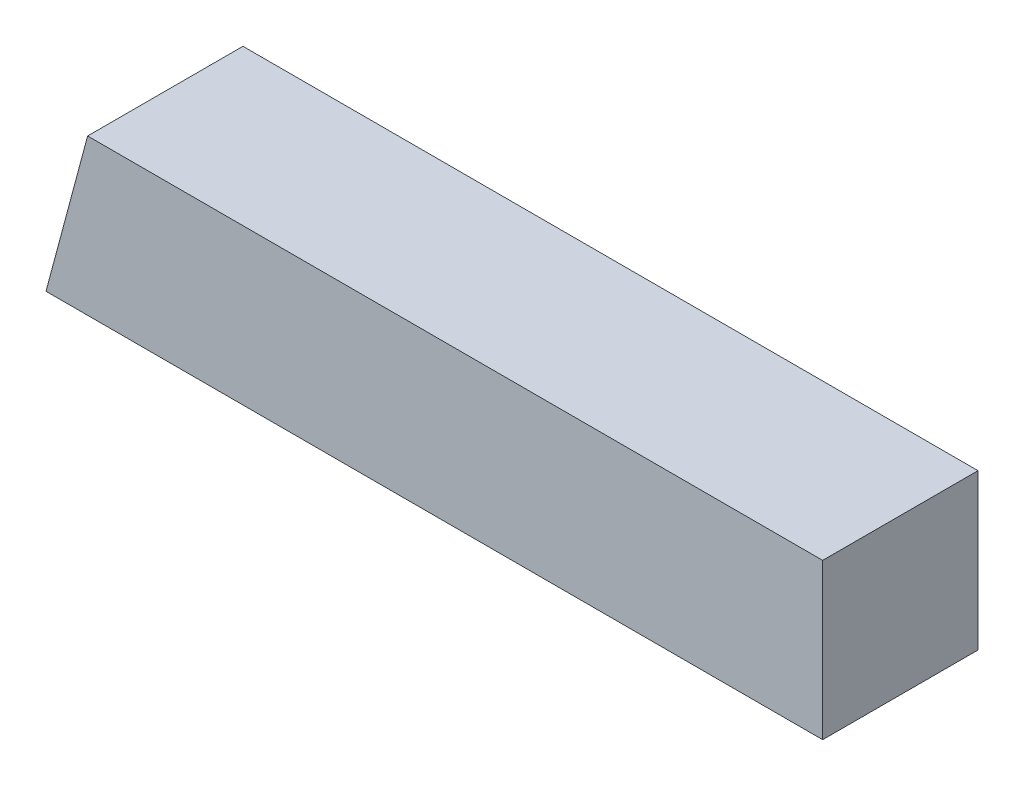
ISO-10303-21;
HEADER;
FILE_DESCRIPTION(('STEP AP214'),'2;1');
FILE_NAME('part.step','',(''),(''),'','','');
FILE_SCHEMA(('AUTOMOTIVE_DESIGN { 1 0 10303 214 1 1 1 1 }'));
ENDSEC;
DATA;
#1=APPLICATION_CONTEXT('core data for automotive mechanical design processes');
#2=APPLICATION_PROTOCOL_DEFINITION('international standard','automotive_design',2000,#1);
#3=PRODUCT_CONTEXT('',#1,'mechanical');
#4=PRODUCT('Part','Part','',(#3));
#5=PRODUCT_RELATED_PRODUCT_CATEGORY('part','',(#4));
#6=PRODUCT_DEFINITION_FORMATION('','',#4);
#7=PRODUCT_DEFINITION_CONTEXT('part definition',#1,'design');
#8=PRODUCT_DEFINITION('design','',#6,#7);
#9=PRODUCT_DEFINITION_SHAPE('','',#8);
#10=(LENGTH_UNIT() NAMED_UNIT(*) SI_UNIT(.MILLI.,.METRE.));
#11=(NAMED_UNIT(*) PLANE_ANGLE_UNIT() SI_UNIT($,.RADIAN.));
#12=(NAMED_UNIT(*) SI_UNIT($,.STERADIAN.) SOLID_ANGLE_UNIT());
#13=UNCERTAINTY_MEASURE_WITH_UNIT(LENGTH_MEASURE(1.E-05),#10,'distance_accuracy_value','');
#14=(GEOMETRIC_REPRESENTATION_CONTEXT(3) GLOBAL_UNCERTAINTY_ASSIGNED_CONTEXT((#13)) GLOBAL_UNIT_ASSIGNED_CONTEXT((#10,
#11,#12)) REPRESENTATION_CONTEXT('',''));
#15=CARTESIAN_POINT('',(0.,0.,0.));
#16=DIRECTION('',(0.,0.,1.));
#17=DIRECTION('',(1.,0.,0.));
#18=AXIS2_PLACEMENT_3D('',#15,#16,#17);
#19=CARTESIAN_POINT('',(-43.3443776664571,-15.2297524609003,30.));
#20=DIRECTION('',(0.,1.,0.));
#21=DIRECTION('',(-1.,0.,0.));
#22=AXIS2_PLACEMENT_3D('',#19,#20,#21);
#23=PLANE('',#22);
#24=DIRECTION('',(1.,0.,0.));
#25=VECTOR('',#24,1.);
#26=CARTESIAN_POINT('',(-43.3443776664571,-15.2297524609003,0.));
#27=LINE('',#26,#25);
#28=CARTESIAN_POINT('',(-43.3443776664571,-15.2297524609003,0.));
#29=VERTEX_POINT('',#28);
#30=CARTESIAN_POINT('',(106.655622333543,-15.2297524609003,0.));
#31=VERTEX_POINT('',#30);
#32=EDGE_CURVE('E96',#29,#31,#27,.T.);
#33=ORIENTED_EDGE('',*,*,#32,.T.);
#34=DIRECTION('',(0.,0.,-1.));
#35=VECTOR('',#34,1.);
#36=CARTESIAN_POINT('',(106.655622333543,-15.2297524609003,30.));
#37=LINE('',#36,#35);
#38=CARTESIAN_POINT('',(106.655622333543,-15.2297524609003,30.));
#39=VERTEX_POINT('',#38);
#40=EDGE_CURVE('E11',#39,#31,#37,.T.);
#41=ORIENTED_EDGE('',*,*,#40,.F.);
#42=DIRECTION('',(1.,0.,0.));
#43=VECTOR('',#42,1.);
#44=CARTESIAN_POINT('',(-43.3443776664571,-15.2297524609003,30.));
#45=LINE('',#44,#43);
#46=CARTESIAN_POINT('',(-43.3443776664571,-15.2297524609003,30.));
#47=VERTEX_POINT('',#46);
#48=EDGE_CURVE('E84',#47,#39,#45,.T.);
#49=ORIENTED_EDGE('',*,*,#48,.F.);
#50=DIRECTION('',(0.,0.,-1.));
#51=VECTOR('',#50,1.);
#52=CARTESIAN_POINT('',(-43.3443776664571,-15.2297524609003,30.));
#53=LINE('',#52,#51);
#54=EDGE_CURVE('E92',#47,#29,#53,.T.);
#55=ORIENTED_EDGE('',*,*,#54,.T.);
#56=EDGE_LOOP('',(#33,#41,#49,#55));
#57=FACE_BOUND('',#56,.T.);
#58=ADVANCED_FACE('F33',(#57),#23,.F.);
#59=CARTESIAN_POINT('',(106.655622333543,-15.2297524609003,30.));
#60=DIRECTION('',(-1.,0.,0.));
#61=DIRECTION('',(0.,-1.,0.));
#62=AXIS2_PLACEMENT_3D('',#59,#60,#61);
#63=PLANE('',#62);
#64=DIRECTION('',(0.,1.,0.));
#65=VECTOR('',#64,1.);
#66=CARTESIAN_POINT('',(106.655622333543,-15.2297524609003,0.));
#67=LINE('',#66,#65);
#68=CARTESIAN_POINT('',(106.655622333543,14.7702475390997,0.));
#69=VERTEX_POINT('',#68);
#70=EDGE_CURVE('E88',#31,#69,#67,.T.);
#71=ORIENTED_EDGE('',*,*,#70,.T.);
#72=DIRECTION('',(0.,0.,-1.));
#73=VECTOR('',#72,1.);
#74=CARTESIAN_POINT('',(106.655622333543,14.7702475390997,30.));
#75=LINE('',#74,#73);
#76=CARTESIAN_POINT('',(106.655622333543,14.7702475390997,30.));
#77=VERTEX_POINT('',#76);
#78=EDGE_CURVE('E41',#77,#69,#75,.T.);
#79=ORIENTED_EDGE('',*,*,#78,.F.);
#80=DIRECTION('',(0.,1.,0.));
#81=VECTOR('',#80,1.);
#82=CARTESIAN_POINT('',(106.655622333543,-15.2297524609003,30.));
#83=LINE('',#82,#81);
#84=EDGE_CURVE('E79',#39,#77,#83,.T.);
#85=ORIENTED_EDGE('',*,*,#84,.F.);
#86=ORIENTED_EDGE('',*,*,#40,.T.);
#87=EDGE_LOOP('',(#71,#79,#85,#86));
#88=FACE_BOUND('',#87,.T.);
#89=ADVANCED_FACE('F87',(#88),#63,.F.);
#90=CARTESIAN_POINT('',(-35.3059018935235,14.7702475390997,30.));
#91=DIRECTION('',(0.,-1.,0.));
#92=DIRECTION('',(1.,0.,0.));
#93=AXIS2_PLACEMENT_3D('',#90,#91,#92);
#94=PLANE('',#93);
#95=DIRECTION('',(-1.,0.,0.));
#96=VECTOR('',#95,1.);
#97=CARTESIAN_POINT('',(-35.3059018935235,14.7702475390997,0.));
#98=LINE('',#97,#96);
#99=CARTESIAN_POINT('',(-35.3059018935235,14.7702475390997,0.));
#100=VERTEX_POINT('',#99);
#101=EDGE_CURVE('E66',#69,#100,#98,.T.);
#102=ORIENTED_EDGE('',*,*,#101,.T.);
#103=DIRECTION('',(0.,0.,-1.));
#104=VECTOR('',#103,1.);
#105=CARTESIAN_POINT('',(-35.3059018935235,14.7702475390997,30.));
#106=LINE('',#105,#104);
#107=CARTESIAN_POINT('',(-35.3059018935235,14.7702475390997,30.));
#108=VERTEX_POINT('',#107);
#109=EDGE_CURVE('E89',#108,#100,#106,.T.);
#110=ORIENTED_EDGE('',*,*,#109,.F.);
#111=DIRECTION('',(-1.,0.,0.));
#112=VECTOR('',#111,1.);
#113=CARTESIAN_POINT('',(-35.3059018935235,14.7702475390997,30.));
#114=LINE('',#113,#112);
#115=EDGE_CURVE('E82',#77,#108,#114,.T.);
#116=ORIENTED_EDGE('',*,*,#115,.F.);
#117=ORIENTED_EDGE('',*,*,#78,.T.);
#118=EDGE_LOOP('',(#102,#110,#116,#117));
#119=FACE_BOUND('',#118,.T.);
#120=ADVANCED_FACE('F90',(#119),#94,.F.);
#121=CARTESIAN_POINT('',(-43.3443776664571,-15.2297524609003,30.));
#122=DIRECTION('',(0.965925826289069,-0.258819045102518,0.));
#123=DIRECTION('',(0.258819045102518,0.965925826289069,0.));
#124=AXIS2_PLACEMENT_3D('',#121,#122,#123);
#125=PLANE('',#124);
#126=DIRECTION('',(-0.258819045102518,-0.965925826289069,0.));
#127=VECTOR('',#126,1.);
#128=CARTESIAN_POINT('',(-43.3443776664571,-15.2297524609003,0.));
#129=LINE('',#128,#127);
#130=EDGE_CURVE('E72',#100,#29,#129,.T.);
#131=ORIENTED_EDGE('',*,*,#130,.T.);
#132=ORIENTED_EDGE('',*,*,#54,.F.);
#133=DIRECTION('',(-0.258819045102518,-0.965925826289069,0.));
#134=VECTOR('',#133,1.);
#135=CARTESIAN_POINT('',(-43.3443776664571,-15.2297524609003,30.));
#136=LINE('',#135,#134);
#137=EDGE_CURVE('E49',#108,#47,#136,.T.);
#138=ORIENTED_EDGE('',*,*,#137,.F.);
#139=ORIENTED_EDGE('',*,*,#109,.T.);
#140=EDGE_LOOP('',(#131,#132,#138,#139));
#141=FACE_BOUND('',#140,.T.);
#142=ADVANCED_FACE('F103',(#141),#125,.F.);
#143=CARTESIAN_POINT('',(0.,0.,30.));
#144=DIRECTION('',(0.,0.,1.));
#145=DIRECTION('',(1.,0.,0.));
#146=AXIS2_PLACEMENT_3D('',#143,#144,#145);
#147=PLANE('',#146);
#148=ORIENTED_EDGE('',*,*,#48,.T.);
#149=ORIENTED_EDGE('',*,*,#84,.T.);
#150=ORIENTED_EDGE('',*,*,#115,.T.);
#151=ORIENTED_EDGE('',*,*,#137,.T.);
#152=EDGE_LOOP('',(#148,#149,#150,#151));
#153=FACE_BOUND('',#152,.T.);
#154=ADVANCED_FACE('F80',(#153),#147,.T.);
#155=CARTESIAN_POINT('',(0.,0.,0.));
#156=DIRECTION('',(0.,0.,1.));
#157=DIRECTION('',(1.,0.,0.));
#158=AXIS2_PLACEMENT_3D('',#155,#156,#157);
#159=PLANE('',#158);
#160=ORIENTED_EDGE('',*,*,#32,.F.);
#161=ORIENTED_EDGE('',*,*,#130,.F.);
#162=ORIENTED_EDGE('',*,*,#101,.F.);
#163=ORIENTED_EDGE('',*,*,#70,.F.);
#164=EDGE_LOOP('',(#160,#161,#162,#163));
#165=FACE_BOUND('',#164,.T.);
#166=ADVANCED_FACE('F106',(#165),#159,.F.);
#167=CLOSED_SHELL('',(#58,#89,#120,#142,#154,#166));
#168=MANIFOLD_SOLID_BREP('B2',#167);
#169=ADVANCED_BREP_SHAPE_REPRESENTATION('',(#18,#168),#14);
#170=SHAPE_DEFINITION_REPRESENTATION(#9,#169);
ENDSEC;
END-ISO-10303-21;
